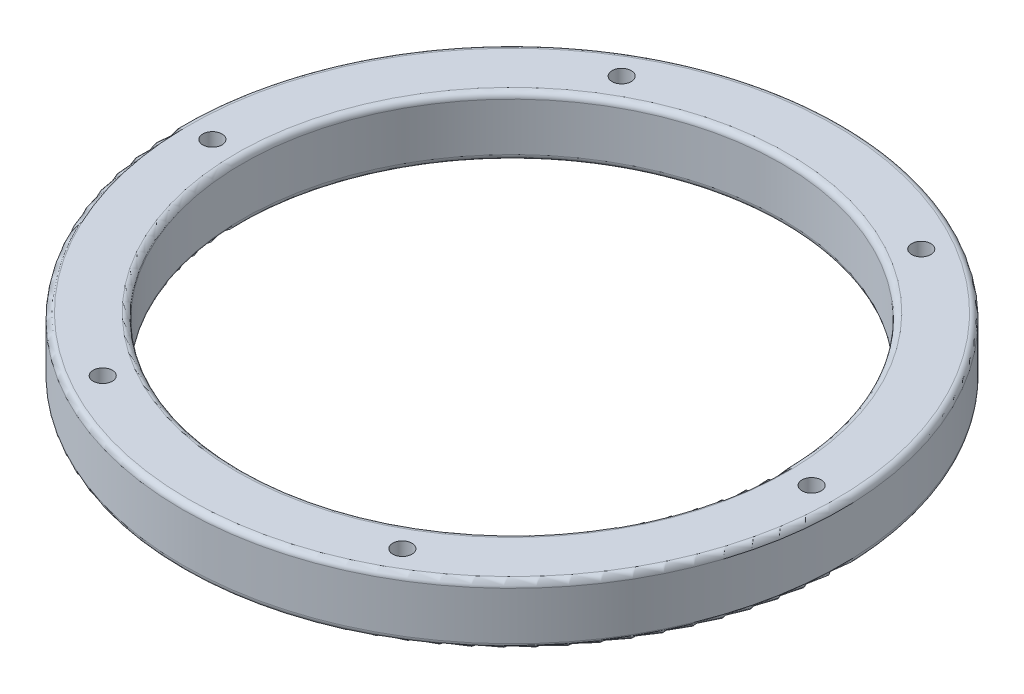
ISO-10303-21;
HEADER;
FILE_DESCRIPTION(('STEP AP214'),'2;1');
FILE_NAME('part.step','',(''),(''),'','','');
FILE_SCHEMA(('AUTOMOTIVE_DESIGN { 1 0 10303 214 1 1 1 1 }'));
ENDSEC;
DATA;
#1=APPLICATION_CONTEXT('core data for automotive mechanical design processes');
#2=APPLICATION_PROTOCOL_DEFINITION('international standard','automotive_design',2000,#1);
#3=PRODUCT_CONTEXT('',#1,'mechanical');
#4=PRODUCT('Part','Part','',(#3));
#5=PRODUCT_RELATED_PRODUCT_CATEGORY('part','',(#4));
#6=PRODUCT_DEFINITION_FORMATION('','',#4);
#7=PRODUCT_DEFINITION_CONTEXT('part definition',#1,'design');
#8=PRODUCT_DEFINITION('design','',#6,#7);
#9=PRODUCT_DEFINITION_SHAPE('','',#8);
#10=(LENGTH_UNIT() NAMED_UNIT(*) SI_UNIT(.MILLI.,.METRE.));
#11=(NAMED_UNIT(*) PLANE_ANGLE_UNIT() SI_UNIT($,.RADIAN.));
#12=(NAMED_UNIT(*) SI_UNIT($,.STERADIAN.) SOLID_ANGLE_UNIT());
#13=UNCERTAINTY_MEASURE_WITH_UNIT(LENGTH_MEASURE(1.E-05),#10,'distance_accuracy_value','');
#14=(GEOMETRIC_REPRESENTATION_CONTEXT(3) GLOBAL_UNCERTAINTY_ASSIGNED_CONTEXT((#13)) GLOBAL_UNIT_ASSIGNED_CONTEXT((#10,
#11,#12)) REPRESENTATION_CONTEXT('',''));
#15=CARTESIAN_POINT('',(0.,0.,0.));
#16=DIRECTION('',(0.,0.,1.));
#17=DIRECTION('',(1.,0.,0.));
#18=AXIS2_PLACEMENT_3D('',#15,#16,#17);
#19=CARTESIAN_POINT('',(0.,10.,0.));
#20=DIRECTION('',(0.,1.,0.));
#21=DIRECTION('',(0.,0.,1.));
#22=AXIS2_PLACEMENT_3D('',#19,#20,#21);
#23=PLANE('',#22);
#24=CARTESIAN_POINT('',(0.,10.,0.));
#25=DIRECTION('',(0.,1.,0.));
#26=DIRECTION('',(0.,0.,1.));
#27=AXIS2_PLACEMENT_3D('',#24,#25,#26);
#28=CIRCLE('',#27,54.);
#29=CARTESIAN_POINT('',(0.,10.,54.));
#30=VERTEX_POINT('',#29);
#31=EDGE_CURVE('E52',#30,#30,#28,.T.);
#32=ORIENTED_EDGE('',*,*,#31,.T.);
#33=EDGE_LOOP('',(#32));
#34=FACE_BOUND('',#33,.T.);
#35=CARTESIAN_POINT('',(0.,10.,0.));
#36=DIRECTION('',(0.,1.,0.));
#37=DIRECTION('',(0.,0.,1.));
#38=AXIS2_PLACEMENT_3D('',#35,#36,#37);
#39=CIRCLE('',#38,46.);
#40=CARTESIAN_POINT('',(0.,10.,46.));
#41=VERTEX_POINT('',#40);
#42=EDGE_CURVE('E56',#41,#41,#39,.F.);
#43=ORIENTED_EDGE('',*,*,#42,.T.);
#44=EDGE_LOOP('',(#43));
#45=FACE_BOUND('',#44,.T.);
#46=CARTESIAN_POINT('',(-25.,10.,-43.3012701892219));
#47=DIRECTION('',(0.,1.,0.));
#48=DIRECTION('',(0.,0.,1.));
#49=AXIS2_PLACEMENT_3D('',#46,#47,#48);
#50=CIRCLE('',#49,1.6);
#51=CARTESIAN_POINT('',(-25.,10.,-41.7012701892219));
#52=VERTEX_POINT('',#51);
#53=EDGE_CURVE('E95',#52,#52,#50,.T.);
#54=ORIENTED_EDGE('',*,*,#53,.F.);
#55=EDGE_LOOP('',(#54));
#56=FACE_BOUND('',#55,.T.);
#57=CARTESIAN_POINT('',(-25.,10.,43.3012701892219));
#58=DIRECTION('',(0.,1.,0.));
#59=DIRECTION('',(0.,0.,1.));
#60=AXIS2_PLACEMENT_3D('',#57,#58,#59);
#61=CIRCLE('',#60,1.6);
#62=CARTESIAN_POINT('',(-25.,10.,44.9012701892219));
#63=VERTEX_POINT('',#62);
#64=EDGE_CURVE('E83',#63,#63,#61,.T.);
#65=ORIENTED_EDGE('',*,*,#64,.F.);
#66=EDGE_LOOP('',(#65));
#67=FACE_BOUND('',#66,.T.);
#68=CARTESIAN_POINT('',(50.,10.,0.));
#69=DIRECTION('',(0.,1.,0.));
#70=DIRECTION('',(0.,0.,1.));
#71=AXIS2_PLACEMENT_3D('',#68,#69,#70);
#72=CIRCLE('',#71,1.6);
#73=CARTESIAN_POINT('',(50.,10.,1.6));
#74=VERTEX_POINT('',#73);
#75=EDGE_CURVE('E73',#74,#74,#72,.T.);
#76=ORIENTED_EDGE('',*,*,#75,.F.);
#77=EDGE_LOOP('',(#76));
#78=FACE_BOUND('',#77,.T.);
#79=CARTESIAN_POINT('',(25.,10.,43.3012701892219));
#80=DIRECTION('',(0.,1.,0.));
#81=DIRECTION('',(0.,0.,1.));
#82=AXIS2_PLACEMENT_3D('',#79,#80,#81);
#83=CIRCLE('',#82,1.6);
#84=CARTESIAN_POINT('',(25.,10.,44.9012701892219));
#85=VERTEX_POINT('',#84);
#86=EDGE_CURVE('E77',#85,#85,#83,.T.);
#87=ORIENTED_EDGE('',*,*,#86,.F.);
#88=EDGE_LOOP('',(#87));
#89=FACE_BOUND('',#88,.T.);
#90=CARTESIAN_POINT('',(-50.,10.,0.));
#91=DIRECTION('',(0.,1.,0.));
#92=DIRECTION('',(0.,0.,1.));
#93=AXIS2_PLACEMENT_3D('',#90,#91,#92);
#94=CIRCLE('',#93,1.6);
#95=CARTESIAN_POINT('',(-50.,10.,1.59999999999999));
#96=VERTEX_POINT('',#95);
#97=EDGE_CURVE('E89',#96,#96,#94,.T.);
#98=ORIENTED_EDGE('',*,*,#97,.F.);
#99=EDGE_LOOP('',(#98));
#100=FACE_BOUND('',#99,.T.);
#101=CARTESIAN_POINT('',(25.,10.,-43.3012701892219));
#102=DIRECTION('',(0.,1.,0.));
#103=DIRECTION('',(0.,0.,1.));
#104=AXIS2_PLACEMENT_3D('',#101,#102,#103);
#105=CIRCLE('',#104,1.6);
#106=CARTESIAN_POINT('',(25.,10.,-41.7012701892219));
#107=VERTEX_POINT('',#106);
#108=EDGE_CURVE('E101',#107,#107,#105,.T.);
#109=ORIENTED_EDGE('',*,*,#108,.F.);
#110=EDGE_LOOP('',(#109));
#111=FACE_BOUND('',#110,.T.);
#112=ADVANCED_FACE('F41',(#34,#45,#56,#67,#78,#89,#100,#111),#23,.T.);
#113=CARTESIAN_POINT('',(0.,0.,0.));
#114=DIRECTION('',(0.,1.,0.));
#115=DIRECTION('',(0.,0.,1.));
#116=AXIS2_PLACEMENT_3D('',#113,#114,#115);
#117=PLANE('',#116);
#118=CARTESIAN_POINT('',(0.,0.,0.));
#119=DIRECTION('',(0.,1.,0.));
#120=DIRECTION('',(0.,0.,1.));
#121=AXIS2_PLACEMENT_3D('',#118,#119,#120);
#122=CIRCLE('',#121,54.);
#123=CARTESIAN_POINT('',(0.,0.,54.));
#124=VERTEX_POINT('',#123);
#125=EDGE_CURVE('E61',#124,#124,#122,.F.);
#126=ORIENTED_EDGE('',*,*,#125,.T.);
#127=EDGE_LOOP('',(#126));
#128=FACE_BOUND('',#127,.T.);
#129=CARTESIAN_POINT('',(0.,0.,0.));
#130=DIRECTION('',(0.,1.,0.));
#131=DIRECTION('',(0.,0.,1.));
#132=AXIS2_PLACEMENT_3D('',#129,#130,#131);
#133=CIRCLE('',#132,46.);
#134=CARTESIAN_POINT('',(0.,0.,46.));
#135=VERTEX_POINT('',#134);
#136=EDGE_CURVE('E64',#135,#135,#133,.T.);
#137=ORIENTED_EDGE('',*,*,#136,.T.);
#138=EDGE_LOOP('',(#137));
#139=FACE_BOUND('',#138,.T.);
#140=CARTESIAN_POINT('',(50.,0.,0.));
#141=DIRECTION('',(0.,1.,0.));
#142=DIRECTION('',(0.,0.,1.));
#143=AXIS2_PLACEMENT_3D('',#140,#141,#142);
#144=CIRCLE('',#143,1.6);
#145=CARTESIAN_POINT('',(50.,0.,1.6));
#146=VERTEX_POINT('',#145);
#147=EDGE_CURVE('E74',#146,#146,#144,.T.);
#148=ORIENTED_EDGE('',*,*,#147,.T.);
#149=EDGE_LOOP('',(#148));
#150=FACE_BOUND('',#149,.T.);
#151=CARTESIAN_POINT('',(25.,0.,43.3012701892219));
#152=DIRECTION('',(0.,1.,0.));
#153=DIRECTION('',(0.,0.,1.));
#154=AXIS2_PLACEMENT_3D('',#151,#152,#153);
#155=CIRCLE('',#154,1.6);
#156=CARTESIAN_POINT('',(25.,0.,44.9012701892219));
#157=VERTEX_POINT('',#156);
#158=EDGE_CURVE('E80',#157,#157,#155,.T.);
#159=ORIENTED_EDGE('',*,*,#158,.T.);
#160=EDGE_LOOP('',(#159));
#161=FACE_BOUND('',#160,.T.);
#162=CARTESIAN_POINT('',(-25.,0.,43.3012701892219));
#163=DIRECTION('',(0.,1.,0.));
#164=DIRECTION('',(0.,0.,1.));
#165=AXIS2_PLACEMENT_3D('',#162,#163,#164);
#166=CIRCLE('',#165,1.6);
#167=CARTESIAN_POINT('',(-25.,0.,44.9012701892219));
#168=VERTEX_POINT('',#167);
#169=EDGE_CURVE('E86',#168,#168,#166,.T.);
#170=ORIENTED_EDGE('',*,*,#169,.T.);
#171=EDGE_LOOP('',(#170));
#172=FACE_BOUND('',#171,.T.);
#173=CARTESIAN_POINT('',(-50.,0.,0.));
#174=DIRECTION('',(0.,1.,0.));
#175=DIRECTION('',(0.,0.,1.));
#176=AXIS2_PLACEMENT_3D('',#173,#174,#175);
#177=CIRCLE('',#176,1.6);
#178=CARTESIAN_POINT('',(-50.,0.,1.59999999999999));
#179=VERTEX_POINT('',#178);
#180=EDGE_CURVE('E92',#179,#179,#177,.T.);
#181=ORIENTED_EDGE('',*,*,#180,.T.);
#182=EDGE_LOOP('',(#181));
#183=FACE_BOUND('',#182,.T.);
#184=CARTESIAN_POINT('',(-25.,0.,-43.3012701892219));
#185=DIRECTION('',(0.,1.,0.));
#186=DIRECTION('',(0.,0.,1.));
#187=AXIS2_PLACEMENT_3D('',#184,#185,#186);
#188=CIRCLE('',#187,1.6);
#189=CARTESIAN_POINT('',(-25.,0.,-41.7012701892219));
#190=VERTEX_POINT('',#189);
#191=EDGE_CURVE('E98',#190,#190,#188,.T.);
#192=ORIENTED_EDGE('',*,*,#191,.T.);
#193=EDGE_LOOP('',(#192));
#194=FACE_BOUND('',#193,.T.);
#195=CARTESIAN_POINT('',(25.,0.,-43.3012701892219));
#196=DIRECTION('',(0.,1.,0.));
#197=DIRECTION('',(0.,0.,1.));
#198=AXIS2_PLACEMENT_3D('',#195,#196,#197);
#199=CIRCLE('',#198,1.6);
#200=CARTESIAN_POINT('',(25.,0.,-41.7012701892219));
#201=VERTEX_POINT('',#200);
#202=EDGE_CURVE('E104',#201,#201,#199,.T.);
#203=ORIENTED_EDGE('',*,*,#202,.T.);
#204=EDGE_LOOP('',(#203));
#205=FACE_BOUND('',#204,.T.);
#206=ADVANCED_FACE('F114',(#128,#139,#150,#161,#172,#183,#194,#205),#117,.F.);
#207=CARTESIAN_POINT('',(0.,10.,0.));
#208=DIRECTION('',(0.,-1.,0.));
#209=DIRECTION('',(0.,0.,-1.));
#210=AXIS2_PLACEMENT_3D('',#207,#208,#209);
#211=CYLINDRICAL_SURFACE('',#210,55.);
#212=CARTESIAN_POINT('',(0.,0.999999999999999,0.));
#213=DIRECTION('',(0.,1.,0.));
#214=DIRECTION('',(0.,0.,1.));
#215=AXIS2_PLACEMENT_3D('',#212,#213,#214);
#216=CIRCLE('',#215,55.);
#217=CARTESIAN_POINT('',(0.,0.999999999999999,55.));
#218=VERTEX_POINT('',#217);
#219=EDGE_CURVE('E67',#218,#218,#216,.T.);
#220=ORIENTED_EDGE('',*,*,#219,.T.);
#221=EDGE_LOOP('',(#220));
#222=FACE_BOUND('',#221,.T.);
#223=CARTESIAN_POINT('',(0.,9.,0.));
#224=DIRECTION('',(0.,1.,0.));
#225=DIRECTION('',(0.,0.,1.));
#226=AXIS2_PLACEMENT_3D('',#223,#224,#225);
#227=CIRCLE('',#226,55.);
#228=CARTESIAN_POINT('',(0.,9.,55.));
#229=VERTEX_POINT('',#228);
#230=EDGE_CURVE('E70',#229,#229,#227,.F.);
#231=ORIENTED_EDGE('',*,*,#230,.T.);
#232=EDGE_LOOP('',(#231));
#233=FACE_BOUND('',#232,.T.);
#234=ADVANCED_FACE('F120',(#222,#233),#211,.T.);
#235=CARTESIAN_POINT('',(0.,10.,0.));
#236=DIRECTION('',(0.,-1.,0.));
#237=DIRECTION('',(0.,0.,-1.));
#238=AXIS2_PLACEMENT_3D('',#235,#236,#237);
#239=CYLINDRICAL_SURFACE('',#238,45.);
#240=CARTESIAN_POINT('',(0.,0.999999999999999,0.));
#241=DIRECTION('',(0.,1.,0.));
#242=DIRECTION('',(0.,0.,1.));
#243=AXIS2_PLACEMENT_3D('',#240,#241,#242);
#244=CIRCLE('',#243,45.);
#245=CARTESIAN_POINT('',(0.,0.999999999999999,45.));
#246=VERTEX_POINT('',#245);
#247=EDGE_CURVE('E10',#246,#246,#244,.F.);
#248=ORIENTED_EDGE('',*,*,#247,.T.);
#249=EDGE_LOOP('',(#248));
#250=FACE_BOUND('',#249,.T.);
#251=CARTESIAN_POINT('',(0.,9.,0.));
#252=DIRECTION('',(0.,1.,0.));
#253=DIRECTION('',(0.,0.,1.));
#254=AXIS2_PLACEMENT_3D('',#251,#252,#253);
#255=CIRCLE('',#254,45.);
#256=CARTESIAN_POINT('',(0.,9.,45.));
#257=VERTEX_POINT('',#256);
#258=EDGE_CURVE('E48',#257,#257,#255,.T.);
#259=ORIENTED_EDGE('',*,*,#258,.T.);
#260=EDGE_LOOP('',(#259));
#261=FACE_BOUND('',#260,.T.);
#262=ADVANCED_FACE('F125',(#250,#261),#239,.F.);
#263=CARTESIAN_POINT('',(50.,10.,0.));
#264=DIRECTION('',(0.,-1.,0.));
#265=DIRECTION('',(0.,0.,-1.));
#266=AXIS2_PLACEMENT_3D('',#263,#264,#265);
#267=CYLINDRICAL_SURFACE('',#266,1.6);
#268=ORIENTED_EDGE('',*,*,#75,.T.);
#269=EDGE_LOOP('',(#268));
#270=FACE_BOUND('',#269,.T.);
#271=ORIENTED_EDGE('',*,*,#147,.F.);
#272=EDGE_LOOP('',(#271));
#273=FACE_BOUND('',#272,.T.);
#274=ADVANCED_FACE('F179',(#270,#273),#267,.F.);
#275=CARTESIAN_POINT('',(25.,10.,43.3012701892219));
#276=DIRECTION('',(0.,-1.,0.));
#277=DIRECTION('',(0.,0.,-1.));
#278=AXIS2_PLACEMENT_3D('',#275,#276,#277);
#279=CYLINDRICAL_SURFACE('',#278,1.6);
#280=ORIENTED_EDGE('',*,*,#86,.T.);
#281=EDGE_LOOP('',(#280));
#282=FACE_BOUND('',#281,.T.);
#283=ORIENTED_EDGE('',*,*,#158,.F.);
#284=EDGE_LOOP('',(#283));
#285=FACE_BOUND('',#284,.T.);
#286=ADVANCED_FACE('F176',(#282,#285),#279,.F.);
#287=CARTESIAN_POINT('',(-25.,10.,43.3012701892219));
#288=DIRECTION('',(0.,-1.,0.));
#289=DIRECTION('',(0.,0.,-1.));
#290=AXIS2_PLACEMENT_3D('',#287,#288,#289);
#291=CYLINDRICAL_SURFACE('',#290,1.6);
#292=ORIENTED_EDGE('',*,*,#64,.T.);
#293=EDGE_LOOP('',(#292));
#294=FACE_BOUND('',#293,.T.);
#295=ORIENTED_EDGE('',*,*,#169,.F.);
#296=EDGE_LOOP('',(#295));
#297=FACE_BOUND('',#296,.T.);
#298=ADVANCED_FACE('F172',(#294,#297),#291,.F.);
#299=CARTESIAN_POINT('',(-50.,10.,0.));
#300=DIRECTION('',(0.,-1.,0.));
#301=DIRECTION('',(0.,0.,-1.));
#302=AXIS2_PLACEMENT_3D('',#299,#300,#301);
#303=CYLINDRICAL_SURFACE('',#302,1.6);
#304=ORIENTED_EDGE('',*,*,#97,.T.);
#305=EDGE_LOOP('',(#304));
#306=FACE_BOUND('',#305,.T.);
#307=ORIENTED_EDGE('',*,*,#180,.F.);
#308=EDGE_LOOP('',(#307));
#309=FACE_BOUND('',#308,.T.);
#310=ADVANCED_FACE('F166',(#306,#309),#303,.F.);
#311=CARTESIAN_POINT('',(-25.,10.,-43.3012701892219));
#312=DIRECTION('',(0.,-1.,0.));
#313=DIRECTION('',(0.,0.,-1.));
#314=AXIS2_PLACEMENT_3D('',#311,#312,#313);
#315=CYLINDRICAL_SURFACE('',#314,1.6);
#316=ORIENTED_EDGE('',*,*,#53,.T.);
#317=EDGE_LOOP('',(#316));
#318=FACE_BOUND('',#317,.T.);
#319=ORIENTED_EDGE('',*,*,#191,.F.);
#320=EDGE_LOOP('',(#319));
#321=FACE_BOUND('',#320,.T.);
#322=ADVANCED_FACE('F161',(#318,#321),#315,.F.);
#323=CARTESIAN_POINT('',(25.,10.,-43.3012701892219));
#324=DIRECTION('',(0.,-1.,0.));
#325=DIRECTION('',(0.,0.,-1.));
#326=AXIS2_PLACEMENT_3D('',#323,#324,#325);
#327=CYLINDRICAL_SURFACE('',#326,1.6);
#328=ORIENTED_EDGE('',*,*,#108,.T.);
#329=EDGE_LOOP('',(#328));
#330=FACE_BOUND('',#329,.T.);
#331=ORIENTED_EDGE('',*,*,#202,.F.);
#332=EDGE_LOOP('',(#331));
#333=FACE_BOUND('',#332,.T.);
#334=ADVANCED_FACE('F110',(#330,#333),#327,.F.);
#335=CARTESIAN_POINT('',(0.,0.999999999999999,0.));
#336=DIRECTION('',(0.,1.,0.));
#337=DIRECTION('',(0.,0.,1.));
#338=AXIS2_PLACEMENT_3D('',#335,#336,#337);
#339=TOROIDAL_SURFACE('',#338,54.,1.);
#340=ORIENTED_EDGE('',*,*,#125,.F.);
#341=EDGE_LOOP('',(#340));
#342=FACE_BOUND('',#341,.T.);
#343=ORIENTED_EDGE('',*,*,#219,.F.);
#344=EDGE_LOOP('',(#343));
#345=FACE_BOUND('',#344,.T.);
#346=ADVANCED_FACE('F131',(#342,#345),#339,.T.);
#347=CARTESIAN_POINT('',(0.,9.,0.));
#348=DIRECTION('',(0.,1.,0.));
#349=DIRECTION('',(0.,0.,1.));
#350=AXIS2_PLACEMENT_3D('',#347,#348,#349);
#351=TOROIDAL_SURFACE('',#350,54.,1.);
#352=ORIENTED_EDGE('',*,*,#230,.F.);
#353=EDGE_LOOP('',(#352));
#354=FACE_BOUND('',#353,.T.);
#355=ORIENTED_EDGE('',*,*,#31,.F.);
#356=EDGE_LOOP('',(#355));
#357=FACE_BOUND('',#356,.T.);
#358=ADVANCED_FACE('F134',(#354,#357),#351,.T.);
#359=CARTESIAN_POINT('',(0.,0.999999999999999,0.));
#360=DIRECTION('',(0.,1.,0.));
#361=DIRECTION('',(0.,0.,1.));
#362=AXIS2_PLACEMENT_3D('',#359,#360,#361);
#363=TOROIDAL_SURFACE('',#362,46.,1.);
#364=ORIENTED_EDGE('',*,*,#247,.F.);
#365=EDGE_LOOP('',(#364));
#366=FACE_BOUND('',#365,.T.);
#367=ORIENTED_EDGE('',*,*,#136,.F.);
#368=EDGE_LOOP('',(#367));
#369=FACE_BOUND('',#368,.T.);
#370=ADVANCED_FACE('F137',(#366,#369),#363,.T.);
#371=CARTESIAN_POINT('',(0.,9.,0.));
#372=DIRECTION('',(0.,1.,0.));
#373=DIRECTION('',(0.,0.,1.));
#374=AXIS2_PLACEMENT_3D('',#371,#372,#373);
#375=TOROIDAL_SURFACE('',#374,46.,1.);
#376=ORIENTED_EDGE('',*,*,#42,.F.);
#377=EDGE_LOOP('',(#376));
#378=FACE_BOUND('',#377,.T.);
#379=ORIENTED_EDGE('',*,*,#258,.F.);
#380=EDGE_LOOP('',(#379));
#381=FACE_BOUND('',#380,.T.);
#382=ADVANCED_FACE('F43',(#378,#381),#375,.T.);
#383=CLOSED_SHELL('',(#112,#206,#234,#262,#274,#286,#298,#310,#322,#334,#346,#358,#370,#382));
#384=MANIFOLD_SOLID_BREP('B2',#383);
#385=ADVANCED_BREP_SHAPE_REPRESENTATION('',(#18,#384),#14);
#386=SHAPE_DEFINITION_REPRESENTATION(#9,#385);
ENDSEC;
END-ISO-10303-21;
